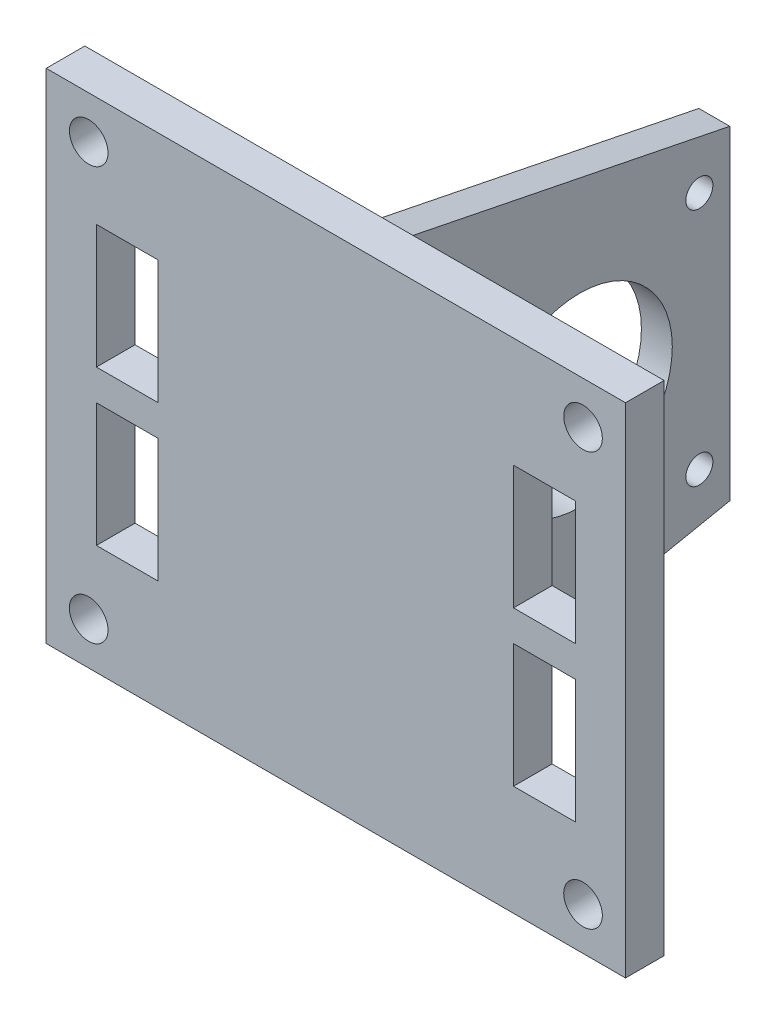
ISO-10303-21;
HEADER;
FILE_DESCRIPTION(('STEP AP214'),'2;1');
FILE_NAME('part.step','',(''),(''),'','','');
FILE_SCHEMA(('AUTOMOTIVE_DESIGN { 1 0 10303 214 1 1 1 1 }'));
ENDSEC;
DATA;
#1=APPLICATION_CONTEXT('core data for automotive mechanical design processes');
#2=APPLICATION_PROTOCOL_DEFINITION('international standard','automotive_design',2000,#1);
#3=PRODUCT_CONTEXT('',#1,'mechanical');
#4=PRODUCT('Part','Part','',(#3));
#5=PRODUCT_RELATED_PRODUCT_CATEGORY('part','',(#4));
#6=PRODUCT_DEFINITION_FORMATION('','',#4);
#7=PRODUCT_DEFINITION_CONTEXT('part definition',#1,'design');
#8=PRODUCT_DEFINITION('design','',#6,#7);
#9=PRODUCT_DEFINITION_SHAPE('','',#8);
#10=(LENGTH_UNIT() NAMED_UNIT(*) SI_UNIT(.MILLI.,.METRE.));
#11=(NAMED_UNIT(*) PLANE_ANGLE_UNIT() SI_UNIT($,.RADIAN.));
#12=(NAMED_UNIT(*) SI_UNIT($,.STERADIAN.) SOLID_ANGLE_UNIT());
#13=UNCERTAINTY_MEASURE_WITH_UNIT(LENGTH_MEASURE(1.E-05),#10,'distance_accuracy_value','');
#14=(GEOMETRIC_REPRESENTATION_CONTEXT(3) GLOBAL_UNCERTAINTY_ASSIGNED_CONTEXT((#13)) GLOBAL_UNIT_ASSIGNED_CONTEXT((#10,
#11,#12)) REPRESENTATION_CONTEXT('',''));
#15=CARTESIAN_POINT('',(0.,0.,0.));
#16=DIRECTION('',(0.,0.,1.));
#17=DIRECTION('',(1.,0.,0.));
#18=AXIS2_PLACEMENT_3D('',#15,#16,#17);
#19=CARTESIAN_POINT('',(0.,0.,0.));
#20=DIRECTION('',(0.,0.,1.));
#21=DIRECTION('',(1.,0.,0.));
#22=AXIS2_PLACEMENT_3D('',#19,#20,#21);
#23=PLANE('',#22);
#24=DIRECTION('',(1.,0.,0.));
#25=VECTOR('',#24,1.);
#26=CARTESIAN_POINT('',(-31.,18.,0.));
#27=LINE('',#26,#25);
#28=CARTESIAN_POINT('',(-31.,18.,0.));
#29=VERTEX_POINT('',#28);
#30=CARTESIAN_POINT('',(-23.,18.,0.));
#31=VERTEX_POINT('',#30);
#32=EDGE_CURVE('E290',#29,#31,#27,.T.);
#33=ORIENTED_EDGE('',*,*,#32,.F.);
#34=DIRECTION('',(0.,1.,0.));
#35=VECTOR('',#34,1.);
#36=CARTESIAN_POINT('',(-31.,2.,0.));
#37=LINE('',#36,#35);
#38=CARTESIAN_POINT('',(-31.,2.,0.));
#39=VERTEX_POINT('',#38);
#40=EDGE_CURVE('E54',#39,#29,#37,.T.);
#41=ORIENTED_EDGE('',*,*,#40,.F.);
#42=DIRECTION('',(-1.,0.,0.));
#43=VECTOR('',#42,1.);
#44=CARTESIAN_POINT('',(-31.,2.,0.));
#45=LINE('',#44,#43);
#46=CARTESIAN_POINT('',(-23.,2.,0.));
#47=VERTEX_POINT('',#46);
#48=EDGE_CURVE('E279',#47,#39,#45,.T.);
#49=ORIENTED_EDGE('',*,*,#48,.F.);
#50=DIRECTION('',(0.,-1.,0.));
#51=VECTOR('',#50,1.);
#52=CARTESIAN_POINT('',(-23.,2.,0.));
#53=LINE('',#52,#51);
#54=EDGE_CURVE('E293',#31,#47,#53,.T.);
#55=ORIENTED_EDGE('',*,*,#54,.F.);
#56=EDGE_LOOP('',(#33,#41,#49,#55));
#57=FACE_BOUND('',#56,.T.);
#58=DIRECTION('',(0.,-1.,0.));
#59=VECTOR('',#58,1.);
#60=CARTESIAN_POINT('',(-23.,-2.,0.));
#61=LINE('',#60,#59);
#62=CARTESIAN_POINT('',(-23.,-2.,0.));
#63=VERTEX_POINT('',#62);
#64=CARTESIAN_POINT('',(-23.,-18.,0.));
#65=VERTEX_POINT('',#64);
#66=EDGE_CURVE('E260',#63,#65,#61,.T.);
#67=ORIENTED_EDGE('',*,*,#66,.F.);
#68=DIRECTION('',(1.,0.,0.));
#69=VECTOR('',#68,1.);
#70=CARTESIAN_POINT('',(-31.,-2.,0.));
#71=LINE('',#70,#69);
#72=CARTESIAN_POINT('',(-31.,-2.,0.));
#73=VERTEX_POINT('',#72);
#74=EDGE_CURVE('E62',#73,#63,#71,.T.);
#75=ORIENTED_EDGE('',*,*,#74,.F.);
#76=DIRECTION('',(0.,1.,0.));
#77=VECTOR('',#76,1.);
#78=CARTESIAN_POINT('',(-31.,-2.,0.));
#79=LINE('',#78,#77);
#80=CARTESIAN_POINT('',(-31.,-18.,0.));
#81=VERTEX_POINT('',#80);
#82=EDGE_CURVE('E249',#81,#73,#79,.T.);
#83=ORIENTED_EDGE('',*,*,#82,.F.);
#84=DIRECTION('',(-1.,0.,0.));
#85=VECTOR('',#84,1.);
#86=CARTESIAN_POINT('',(-31.,-18.,0.));
#87=LINE('',#86,#85);
#88=EDGE_CURVE('E264',#65,#81,#87,.T.);
#89=ORIENTED_EDGE('',*,*,#88,.F.);
#90=EDGE_LOOP('',(#67,#75,#83,#89));
#91=FACE_BOUND('',#90,.T.);
#92=DIRECTION('',(-1.,0.,0.));
#93=VECTOR('',#92,1.);
#94=CARTESIAN_POINT('',(31.,-18.,0.));
#95=LINE('',#94,#93);
#96=CARTESIAN_POINT('',(31.,-18.,0.));
#97=VERTEX_POINT('',#96);
#98=CARTESIAN_POINT('',(23.,-18.,0.));
#99=VERTEX_POINT('',#98);
#100=EDGE_CURVE('E234',#97,#99,#95,.T.);
#101=ORIENTED_EDGE('',*,*,#100,.F.);
#102=DIRECTION('',(0.,-1.,0.));
#103=VECTOR('',#102,1.);
#104=CARTESIAN_POINT('',(31.,-2.,0.));
#105=LINE('',#104,#103);
#106=CARTESIAN_POINT('',(31.,-2.,0.));
#107=VERTEX_POINT('',#106);
#108=EDGE_CURVE('E207',#107,#97,#105,.T.);
#109=ORIENTED_EDGE('',*,*,#108,.F.);
#110=DIRECTION('',(1.,0.,0.));
#111=VECTOR('',#110,1.);
#112=CARTESIAN_POINT('',(31.,-2.,0.));
#113=LINE('',#112,#111);
#114=CARTESIAN_POINT('',(23.,-2.,0.));
#115=VERTEX_POINT('',#114);
#116=EDGE_CURVE('E225',#115,#107,#113,.T.);
#117=ORIENTED_EDGE('',*,*,#116,.F.);
#118=DIRECTION('',(0.,1.,0.));
#119=VECTOR('',#118,1.);
#120=CARTESIAN_POINT('',(23.,-2.,0.));
#121=LINE('',#120,#119);
#122=EDGE_CURVE('E228',#99,#115,#121,.T.);
#123=ORIENTED_EDGE('',*,*,#122,.F.);
#124=EDGE_LOOP('',(#101,#109,#117,#123));
#125=FACE_BOUND('',#124,.T.);
#126=DIRECTION('',(-1.,0.,0.));
#127=VECTOR('',#126,1.);
#128=CARTESIAN_POINT('',(31.,2.,0.));
#129=LINE('',#128,#127);
#130=CARTESIAN_POINT('',(31.,2.,0.));
#131=VERTEX_POINT('',#130);
#132=CARTESIAN_POINT('',(23.,2.,0.));
#133=VERTEX_POINT('',#132);
#134=EDGE_CURVE('E319',#131,#133,#129,.T.);
#135=ORIENTED_EDGE('',*,*,#134,.F.);
#136=DIRECTION('',(0.,-1.,0.));
#137=VECTOR('',#136,1.);
#138=CARTESIAN_POINT('',(31.,2.,0.));
#139=LINE('',#138,#137);
#140=CARTESIAN_POINT('',(31.,18.,0.));
#141=VERTEX_POINT('',#140);
#142=EDGE_CURVE('E241',#141,#131,#139,.T.);
#143=ORIENTED_EDGE('',*,*,#142,.F.);
#144=DIRECTION('',(1.,0.,0.));
#145=VECTOR('',#144,1.);
#146=CARTESIAN_POINT('',(31.,18.,0.));
#147=LINE('',#146,#145);
#148=CARTESIAN_POINT('',(23.,18.,0.));
#149=VERTEX_POINT('',#148);
#150=EDGE_CURVE('E308',#149,#141,#147,.T.);
#151=ORIENTED_EDGE('',*,*,#150,.F.);
#152=DIRECTION('',(0.,1.,0.));
#153=VECTOR('',#152,1.);
#154=CARTESIAN_POINT('',(23.,2.,0.));
#155=LINE('',#154,#153);
#156=EDGE_CURVE('E322',#133,#149,#155,.T.);
#157=ORIENTED_EDGE('',*,*,#156,.F.);
#158=EDGE_LOOP('',(#135,#143,#151,#157));
#159=FACE_BOUND('',#158,.T.);
#160=CARTESIAN_POINT('',(-32.,26.75,0.));
#161=DIRECTION('',(0.,0.,-1.));
#162=DIRECTION('',(-1.,0.,0.));
#163=AXIS2_PLACEMENT_3D('',#160,#161,#162);
#164=CIRCLE('',#163,2.5);
#165=CARTESIAN_POINT('',(-34.5,26.75,0.));
#166=VERTEX_POINT('',#165);
#167=EDGE_CURVE('E336',#166,#166,#164,.T.);
#168=ORIENTED_EDGE('',*,*,#167,.F.);
#169=EDGE_LOOP('',(#168));
#170=FACE_BOUND('',#169,.T.);
#171=CARTESIAN_POINT('',(32.,26.75,0.));
#172=DIRECTION('',(0.,0.,1.));
#173=DIRECTION('',(1.,0.,0.));
#174=AXIS2_PLACEMENT_3D('',#171,#172,#173);
#175=CIRCLE('',#174,2.5);
#176=CARTESIAN_POINT('',(34.5,26.75,0.));
#177=VERTEX_POINT('',#176);
#178=EDGE_CURVE('E339',#177,#177,#175,.T.);
#179=ORIENTED_EDGE('',*,*,#178,.T.);
#180=EDGE_LOOP('',(#179));
#181=FACE_BOUND('',#180,.T.);
#182=DIRECTION('',(0.,-1.,0.));
#183=VECTOR('',#182,1.);
#184=CARTESIAN_POINT('',(-37.5,-32.25,0.));
#185=LINE('',#184,#183);
#186=CARTESIAN_POINT('',(-37.5,32.25,0.));
#187=VERTEX_POINT('',#186);
#188=CARTESIAN_POINT('',(-37.5,-32.25,0.));
#189=VERTEX_POINT('',#188);
#190=EDGE_CURVE('E415',#187,#189,#185,.T.);
#191=ORIENTED_EDGE('',*,*,#190,.F.);
#192=DIRECTION('',(-1.,0.,0.));
#193=VECTOR('',#192,1.);
#194=CARTESIAN_POINT('',(37.5,32.25,0.));
#195=LINE('',#194,#193);
#196=CARTESIAN_POINT('',(37.5,32.25,0.));
#197=VERTEX_POINT('',#196);
#198=EDGE_CURVE('E426',#197,#187,#195,.T.);
#199=ORIENTED_EDGE('',*,*,#198,.F.);
#200=DIRECTION('',(0.,1.,0.));
#201=VECTOR('',#200,1.);
#202=CARTESIAN_POINT('',(37.5,-32.25,0.));
#203=LINE('',#202,#201);
#204=CARTESIAN_POINT('',(37.5,-32.25,0.));
#205=VERTEX_POINT('',#204);
#206=EDGE_CURVE('E437',#205,#197,#203,.T.);
#207=ORIENTED_EDGE('',*,*,#206,.F.);
#208=DIRECTION('',(1.,0.,0.));
#209=VECTOR('',#208,1.);
#210=CARTESIAN_POINT('',(37.5,-32.25,0.));
#211=LINE('',#210,#209);
#212=EDGE_CURVE('E435',#189,#205,#211,.T.);
#213=ORIENTED_EDGE('',*,*,#212,.F.);
#214=EDGE_LOOP('',(#191,#199,#207,#213));
#215=FACE_BOUND('',#214,.T.);
#216=DIRECTION('',(0.,-1.,0.));
#217=VECTOR('',#216,1.);
#218=CARTESIAN_POINT('',(-2.,29.8702225781325,0.));
#219=LINE('',#218,#217);
#220=CARTESIAN_POINT('',(-2.,29.8702225781325,0.));
#221=VERTEX_POINT('',#220);
#222=CARTESIAN_POINT('',(-2.,-29.8702225781326,0.));
#223=VERTEX_POINT('',#222);
#224=EDGE_CURVE('E408',#221,#223,#219,.T.);
#225=ORIENTED_EDGE('',*,*,#224,.T.);
#226=DIRECTION('',(1.,0.,0.));
#227=VECTOR('',#226,1.);
#228=CARTESIAN_POINT('',(-2.,-29.8702225781326,0.));
#229=LINE('',#228,#227);
#230=CARTESIAN_POINT('',(2.,-29.8702225781326,0.));
#231=VERTEX_POINT('',#230);
#232=EDGE_CURVE('E412',#223,#231,#229,.T.);
#233=ORIENTED_EDGE('',*,*,#232,.T.);
#234=DIRECTION('',(0.,-1.,0.));
#235=VECTOR('',#234,1.);
#236=CARTESIAN_POINT('',(2.,29.8702225781325,0.));
#237=LINE('',#236,#235);
#238=CARTESIAN_POINT('',(2.,29.8702225781325,0.));
#239=VERTEX_POINT('',#238);
#240=EDGE_CURVE('E397',#239,#231,#237,.T.);
#241=ORIENTED_EDGE('',*,*,#240,.F.);
#242=DIRECTION('',(1.,0.,0.));
#243=VECTOR('',#242,1.);
#244=CARTESIAN_POINT('',(-2.,29.8702225781325,0.));
#245=LINE('',#244,#243);
#246=EDGE_CURVE('E416',#221,#239,#245,.T.);
#247=ORIENTED_EDGE('',*,*,#246,.F.);
#248=EDGE_LOOP('',(#225,#233,#241,#247));
#249=FACE_BOUND('',#248,.T.);
#250=CARTESIAN_POINT('',(-32.,-26.75,0.));
#251=DIRECTION('',(0.,0.,1.));
#252=DIRECTION('',(1.,0.,0.));
#253=AXIS2_PLACEMENT_3D('',#250,#251,#252);
#254=CIRCLE('',#253,2.5);
#255=CARTESIAN_POINT('',(-29.5,-26.75,0.));
#256=VERTEX_POINT('',#255);
#257=EDGE_CURVE('E343',#256,#256,#254,.T.);
#258=ORIENTED_EDGE('',*,*,#257,.T.);
#259=EDGE_LOOP('',(#258));
#260=FACE_BOUND('',#259,.T.);
#261=CARTESIAN_POINT('',(32.,-26.75,0.));
#262=DIRECTION('',(0.,0.,-1.));
#263=DIRECTION('',(-1.,0.,0.));
#264=AXIS2_PLACEMENT_3D('',#261,#262,#263);
#265=CIRCLE('',#264,2.5);
#266=CARTESIAN_POINT('',(29.5,-26.75,0.));
#267=VERTEX_POINT('',#266);
#268=EDGE_CURVE('E349',#267,#267,#265,.T.);
#269=ORIENTED_EDGE('',*,*,#268,.F.);
#270=EDGE_LOOP('',(#269));
#271=FACE_BOUND('',#270,.T.);
#272=ADVANCED_FACE('F39',(#57,#91,#125,#159,#170,#181,#215,#249,#260,#271),#23,.F.);
#273=CARTESIAN_POINT('',(0.,0.,5.));
#274=DIRECTION('',(0.,0.,1.));
#275=DIRECTION('',(1.,0.,0.));
#276=AXIS2_PLACEMENT_3D('',#273,#274,#275);
#277=PLANE('',#276);
#278=DIRECTION('',(0.,1.,0.));
#279=VECTOR('',#278,1.);
#280=CARTESIAN_POINT('',(-31.,2.,5.));
#281=LINE('',#280,#279);
#282=CARTESIAN_POINT('',(-31.,2.,5.));
#283=VERTEX_POINT('',#282);
#284=CARTESIAN_POINT('',(-31.,18.,5.));
#285=VERTEX_POINT('',#284);
#286=EDGE_CURVE('E275',#283,#285,#281,.T.);
#287=ORIENTED_EDGE('',*,*,#286,.T.);
#288=DIRECTION('',(1.,0.,0.));
#289=VECTOR('',#288,1.);
#290=CARTESIAN_POINT('',(-31.,18.,5.));
#291=LINE('',#290,#289);
#292=CARTESIAN_POINT('',(-23.,18.,5.));
#293=VERTEX_POINT('',#292);
#294=EDGE_CURVE('E278',#285,#293,#291,.T.);
#295=ORIENTED_EDGE('',*,*,#294,.T.);
#296=DIRECTION('',(0.,-1.,0.));
#297=VECTOR('',#296,1.);
#298=CARTESIAN_POINT('',(-23.,2.,5.));
#299=LINE('',#298,#297);
#300=CARTESIAN_POINT('',(-23.,2.,5.));
#301=VERTEX_POINT('',#300);
#302=EDGE_CURVE('E282',#293,#301,#299,.T.);
#303=ORIENTED_EDGE('',*,*,#302,.T.);
#304=DIRECTION('',(-1.,0.,0.));
#305=VECTOR('',#304,1.);
#306=CARTESIAN_POINT('',(-31.,2.,5.));
#307=LINE('',#306,#305);
#308=EDGE_CURVE('E285',#301,#283,#307,.T.);
#309=ORIENTED_EDGE('',*,*,#308,.T.);
#310=EDGE_LOOP('',(#287,#295,#303,#309));
#311=FACE_BOUND('',#310,.T.);
#312=DIRECTION('',(1.,0.,0.));
#313=VECTOR('',#312,1.);
#314=CARTESIAN_POINT('',(-31.,-2.,5.));
#315=LINE('',#314,#313);
#316=CARTESIAN_POINT('',(-31.,-2.,5.));
#317=VERTEX_POINT('',#316);
#318=CARTESIAN_POINT('',(-23.,-2.,5.));
#319=VERTEX_POINT('',#318);
#320=EDGE_CURVE('E245',#317,#319,#315,.T.);
#321=ORIENTED_EDGE('',*,*,#320,.T.);
#322=DIRECTION('',(0.,-1.,0.));
#323=VECTOR('',#322,1.);
#324=CARTESIAN_POINT('',(-23.,-2.,5.));
#325=LINE('',#324,#323);
#326=CARTESIAN_POINT('',(-23.,-18.,5.));
#327=VERTEX_POINT('',#326);
#328=EDGE_CURVE('E248',#319,#327,#325,.T.);
#329=ORIENTED_EDGE('',*,*,#328,.T.);
#330=DIRECTION('',(-1.,0.,0.));
#331=VECTOR('',#330,1.);
#332=CARTESIAN_POINT('',(-31.,-18.,5.));
#333=LINE('',#332,#331);
#334=CARTESIAN_POINT('',(-31.,-18.,5.));
#335=VERTEX_POINT('',#334);
#336=EDGE_CURVE('E252',#327,#335,#333,.T.);
#337=ORIENTED_EDGE('',*,*,#336,.T.);
#338=DIRECTION('',(0.,1.,0.));
#339=VECTOR('',#338,1.);
#340=CARTESIAN_POINT('',(-31.,-2.,5.));
#341=LINE('',#340,#339);
#342=EDGE_CURVE('E255',#335,#317,#341,.T.);
#343=ORIENTED_EDGE('',*,*,#342,.T.);
#344=EDGE_LOOP('',(#321,#329,#337,#343));
#345=FACE_BOUND('',#344,.T.);
#346=DIRECTION('',(0.,-1.,0.));
#347=VECTOR('',#346,1.);
#348=CARTESIAN_POINT('',(31.,-2.,5.));
#349=LINE('',#348,#347);
#350=CARTESIAN_POINT('',(31.,-2.,5.));
#351=VERTEX_POINT('',#350);
#352=CARTESIAN_POINT('',(31.,-18.,5.));
#353=VERTEX_POINT('',#352);
#354=EDGE_CURVE('E204',#351,#353,#349,.T.);
#355=ORIENTED_EDGE('',*,*,#354,.T.);
#356=DIRECTION('',(-1.,0.,0.));
#357=VECTOR('',#356,1.);
#358=CARTESIAN_POINT('',(31.,-18.,5.));
#359=LINE('',#358,#357);
#360=CARTESIAN_POINT('',(23.,-18.,5.));
#361=VERTEX_POINT('',#360);
#362=EDGE_CURVE('E216',#353,#361,#359,.T.);
#363=ORIENTED_EDGE('',*,*,#362,.T.);
#364=DIRECTION('',(0.,1.,0.));
#365=VECTOR('',#364,1.);
#366=CARTESIAN_POINT('',(23.,-2.,5.));
#367=LINE('',#366,#365);
#368=CARTESIAN_POINT('',(23.,-2.,5.));
#369=VERTEX_POINT('',#368);
#370=EDGE_CURVE('E220',#361,#369,#367,.T.);
#371=ORIENTED_EDGE('',*,*,#370,.T.);
#372=DIRECTION('',(1.,0.,0.));
#373=VECTOR('',#372,1.);
#374=CARTESIAN_POINT('',(31.,-2.,5.));
#375=LINE('',#374,#373);
#376=EDGE_CURVE('E212',#369,#351,#375,.T.);
#377=ORIENTED_EDGE('',*,*,#376,.T.);
#378=EDGE_LOOP('',(#355,#363,#371,#377));
#379=FACE_BOUND('',#378,.T.);
#380=DIRECTION('',(0.,-1.,0.));
#381=VECTOR('',#380,1.);
#382=CARTESIAN_POINT('',(31.,2.,5.));
#383=LINE('',#382,#381);
#384=CARTESIAN_POINT('',(31.,18.,5.));
#385=VERTEX_POINT('',#384);
#386=CARTESIAN_POINT('',(31.,2.,5.));
#387=VERTEX_POINT('',#386);
#388=EDGE_CURVE('E304',#385,#387,#383,.T.);
#389=ORIENTED_EDGE('',*,*,#388,.T.);
#390=DIRECTION('',(-1.,0.,0.));
#391=VECTOR('',#390,1.);
#392=CARTESIAN_POINT('',(31.,2.,5.));
#393=LINE('',#392,#391);
#394=CARTESIAN_POINT('',(23.,2.,5.));
#395=VERTEX_POINT('',#394);
#396=EDGE_CURVE('E307',#387,#395,#393,.T.);
#397=ORIENTED_EDGE('',*,*,#396,.T.);
#398=DIRECTION('',(0.,1.,0.));
#399=VECTOR('',#398,1.);
#400=CARTESIAN_POINT('',(23.,2.,5.));
#401=LINE('',#400,#399);
#402=CARTESIAN_POINT('',(23.,18.,5.));
#403=VERTEX_POINT('',#402);
#404=EDGE_CURVE('E311',#395,#403,#401,.T.);
#405=ORIENTED_EDGE('',*,*,#404,.T.);
#406=DIRECTION('',(1.,0.,0.));
#407=VECTOR('',#406,1.);
#408=CARTESIAN_POINT('',(31.,18.,5.));
#409=LINE('',#408,#407);
#410=EDGE_CURVE('E314',#403,#385,#409,.T.);
#411=ORIENTED_EDGE('',*,*,#410,.T.);
#412=EDGE_LOOP('',(#389,#397,#405,#411));
#413=FACE_BOUND('',#412,.T.);
#414=CARTESIAN_POINT('',(-32.,-26.75,5.));
#415=DIRECTION('',(0.,0.,1.));
#416=DIRECTION('',(1.,0.,0.));
#417=AXIS2_PLACEMENT_3D('',#414,#415,#416);
#418=CIRCLE('',#417,2.5);
#419=CARTESIAN_POINT('',(-29.5,-26.75,5.));
#420=VERTEX_POINT('',#419);
#421=EDGE_CURVE('E346',#420,#420,#418,.T.);
#422=ORIENTED_EDGE('',*,*,#421,.F.);
#423=EDGE_LOOP('',(#422));
#424=FACE_BOUND('',#423,.T.);
#425=CARTESIAN_POINT('',(32.,26.75,5.));
#426=DIRECTION('',(0.,0.,1.));
#427=DIRECTION('',(1.,0.,0.));
#428=AXIS2_PLACEMENT_3D('',#425,#426,#427);
#429=CIRCLE('',#428,2.5);
#430=CARTESIAN_POINT('',(34.5,26.75,5.));
#431=VERTEX_POINT('',#430);
#432=EDGE_CURVE('E354',#431,#431,#429,.T.);
#433=ORIENTED_EDGE('',*,*,#432,.F.);
#434=EDGE_LOOP('',(#433));
#435=FACE_BOUND('',#434,.T.);
#436=DIRECTION('',(0.,-1.,0.));
#437=VECTOR('',#436,1.);
#438=CARTESIAN_POINT('',(-37.5,-32.25,5.));
#439=LINE('',#438,#437);
#440=CARTESIAN_POINT('',(-37.5,32.25,5.));
#441=VERTEX_POINT('',#440);
#442=CARTESIAN_POINT('',(-37.5,-32.25,5.));
#443=VERTEX_POINT('',#442);
#444=EDGE_CURVE('E422',#441,#443,#439,.T.);
#445=ORIENTED_EDGE('',*,*,#444,.T.);
#446=DIRECTION('',(1.,0.,0.));
#447=VECTOR('',#446,1.);
#448=CARTESIAN_POINT('',(37.5,-32.25,5.));
#449=LINE('',#448,#447);
#450=CARTESIAN_POINT('',(37.5,-32.25,5.));
#451=VERTEX_POINT('',#450);
#452=EDGE_CURVE('E425',#443,#451,#449,.T.);
#453=ORIENTED_EDGE('',*,*,#452,.T.);
#454=DIRECTION('',(0.,1.,0.));
#455=VECTOR('',#454,1.);
#456=CARTESIAN_POINT('',(37.5,-32.25,5.));
#457=LINE('',#456,#455);
#458=CARTESIAN_POINT('',(37.5,32.25,5.));
#459=VERTEX_POINT('',#458);
#460=EDGE_CURVE('E428',#451,#459,#457,.T.);
#461=ORIENTED_EDGE('',*,*,#460,.T.);
#462=DIRECTION('',(-1.,0.,0.));
#463=VECTOR('',#462,1.);
#464=CARTESIAN_POINT('',(37.5,32.25,5.));
#465=LINE('',#464,#463);
#466=EDGE_CURVE('E430',#459,#441,#465,.T.);
#467=ORIENTED_EDGE('',*,*,#466,.T.);
#468=EDGE_LOOP('',(#445,#453,#461,#467));
#469=FACE_BOUND('',#468,.T.);
#470=CARTESIAN_POINT('',(-32.,26.75,5.));
#471=DIRECTION('',(0.,0.,-1.));
#472=DIRECTION('',(-1.,0.,0.));
#473=AXIS2_PLACEMENT_3D('',#470,#471,#472);
#474=CIRCLE('',#473,2.5);
#475=CARTESIAN_POINT('',(-34.5,26.75,5.));
#476=VERTEX_POINT('',#475);
#477=EDGE_CURVE('E340',#476,#476,#474,.T.);
#478=ORIENTED_EDGE('',*,*,#477,.T.);
#479=EDGE_LOOP('',(#478));
#480=FACE_BOUND('',#479,.T.);
#481=CARTESIAN_POINT('',(32.,-26.75,5.));
#482=DIRECTION('',(0.,0.,-1.));
#483=DIRECTION('',(-1.,0.,0.));
#484=AXIS2_PLACEMENT_3D('',#481,#482,#483);
#485=CIRCLE('',#484,2.5);
#486=CARTESIAN_POINT('',(29.5,-26.75,5.));
#487=VERTEX_POINT('',#486);
#488=EDGE_CURVE('E329',#487,#487,#485,.T.);
#489=ORIENTED_EDGE('',*,*,#488,.T.);
#490=EDGE_LOOP('',(#489));
#491=FACE_BOUND('',#490,.T.);
#492=ADVANCED_FACE('F222',(#311,#345,#379,#413,#424,#435,#469,#480,#491),#277,.T.);
#493=CARTESIAN_POINT('',(-2.,0.,0.));
#494=DIRECTION('',(1.,0.,0.));
#495=DIRECTION('',(0.,0.,-1.));
#496=AXIS2_PLACEMENT_3D('',#493,#494,#495);
#497=PLANE('',#496);
#498=CARTESIAN_POINT('',(-2.,-15.5,-9.05959905154399));
#499=DIRECTION('',(1.,0.,0.));
#500=DIRECTION('',(0.,0.,-1.));
#501=AXIS2_PLACEMENT_3D('',#498,#499,#500);
#502=CIRCLE('',#501,1.75);
#503=CARTESIAN_POINT('',(-2.,-15.5,-10.809599051544));
#504=VERTEX_POINT('',#503);
#505=EDGE_CURVE('E386',#504,#504,#502,.F.);
#506=ORIENTED_EDGE('',*,*,#505,.F.);
#507=EDGE_LOOP('',(#506));
#508=FACE_BOUND('',#507,.T.);
#509=CARTESIAN_POINT('',(-2.,15.5,-9.05959905154399));
#510=DIRECTION('',(1.,0.,0.));
#511=DIRECTION('',(0.,0.,-1.));
#512=AXIS2_PLACEMENT_3D('',#509,#510,#511);
#513=CIRCLE('',#512,1.75);
#514=CARTESIAN_POINT('',(-2.,15.5,-10.809599051544));
#515=VERTEX_POINT('',#514);
#516=EDGE_CURVE('E380',#515,#515,#513,.T.);
#517=ORIENTED_EDGE('',*,*,#516,.T.);
#518=EDGE_LOOP('',(#517));
#519=FACE_BOUND('',#518,.T.);
#520=DIRECTION('',(0.,0.197620224608415,-0.980278657742644));
#521=VECTOR('',#520,1.);
#522=CARTESIAN_POINT('',(-2.,-21.,-44.));
#523=LINE('',#522,#521);
#524=CARTESIAN_POINT('',(-2.,-21.,-44.));
#525=VERTEX_POINT('',#524);
#526=EDGE_CURVE('E399',#223,#525,#523,.T.);
#527=ORIENTED_EDGE('',*,*,#526,.F.);
#528=ORIENTED_EDGE('',*,*,#224,.F.);
#529=DIRECTION('',(0.,0.197620224608415,0.980278657742644));
#530=VECTOR('',#529,1.);
#531=CARTESIAN_POINT('',(-2.,21.,-44.));
#532=LINE('',#531,#530);
#533=CARTESIAN_POINT('',(-2.,21.,-44.));
#534=VERTEX_POINT('',#533);
#535=EDGE_CURVE('E405',#534,#221,#532,.T.);
#536=ORIENTED_EDGE('',*,*,#535,.F.);
#537=DIRECTION('',(0.,1.,0.));
#538=VECTOR('',#537,1.);
#539=CARTESIAN_POINT('',(-2.,21.,-44.));
#540=LINE('',#539,#538);
#541=EDGE_CURVE('E402',#525,#534,#540,.T.);
#542=ORIENTED_EDGE('',*,*,#541,.F.);
#543=EDGE_LOOP('',(#527,#528,#536,#542));
#544=FACE_BOUND('',#543,.T.);
#545=CARTESIAN_POINT('',(-2.,15.5,-40.059599051544));
#546=DIRECTION('',(1.,0.,0.));
#547=DIRECTION('',(0.,0.,-1.));
#548=AXIS2_PLACEMENT_3D('',#545,#546,#547);
#549=CIRCLE('',#548,1.75);
#550=CARTESIAN_POINT('',(-2.,15.5,-41.809599051544));
#551=VERTEX_POINT('',#550);
#552=EDGE_CURVE('E374',#551,#551,#549,.F.);
#553=ORIENTED_EDGE('',*,*,#552,.F.);
#554=EDGE_LOOP('',(#553));
#555=FACE_BOUND('',#554,.T.);
#556=CARTESIAN_POINT('',(-2.,0.,-24.559599051544));
#557=DIRECTION('',(1.,0.,0.));
#558=DIRECTION('',(0.,0.,-1.));
#559=AXIS2_PLACEMENT_3D('',#556,#557,#558);
#560=CIRCLE('',#559,12.);
#561=CARTESIAN_POINT('',(-2.,0.,-36.559599051544));
#562=VERTEX_POINT('',#561);
#563=EDGE_CURVE('E377',#562,#562,#560,.T.);
#564=ORIENTED_EDGE('',*,*,#563,.T.);
#565=EDGE_LOOP('',(#564));
#566=FACE_BOUND('',#565,.T.);
#567=CARTESIAN_POINT('',(-2.,-15.5,-40.059599051544));
#568=DIRECTION('',(1.,0.,0.));
#569=DIRECTION('',(0.,0.,-1.));
#570=AXIS2_PLACEMENT_3D('',#567,#568,#569);
#571=CIRCLE('',#570,1.75);
#572=CARTESIAN_POINT('',(-2.,-15.5,-41.809599051544));
#573=VERTEX_POINT('',#572);
#574=EDGE_CURVE('E383',#573,#573,#571,.T.);
#575=ORIENTED_EDGE('',*,*,#574,.T.);
#576=EDGE_LOOP('',(#575));
#577=FACE_BOUND('',#576,.T.);
#578=ADVANCED_FACE('F479',(#508,#519,#544,#555,#566,#577),#497,.F.);
#579=CARTESIAN_POINT('',(2.,0.,0.));
#580=DIRECTION('',(1.,0.,0.));
#581=DIRECTION('',(0.,0.,-1.));
#582=AXIS2_PLACEMENT_3D('',#579,#580,#581);
#583=PLANE('',#582);
#584=CARTESIAN_POINT('',(2.,-15.5,-9.05959905154399));
#585=DIRECTION('',(-1.,0.,0.));
#586=DIRECTION('',(0.,0.,1.));
#587=AXIS2_PLACEMENT_3D('',#584,#585,#586);
#588=CIRCLE('',#587,1.75);
#589=CARTESIAN_POINT('',(2.,-15.5,-7.30959905154399));
#590=VERTEX_POINT('',#589);
#591=EDGE_CURVE('E357',#590,#590,#588,.T.);
#592=ORIENTED_EDGE('',*,*,#591,.T.);
#593=EDGE_LOOP('',(#592));
#594=FACE_BOUND('',#593,.T.);
#595=CARTESIAN_POINT('',(2.,15.5,-40.059599051544));
#596=DIRECTION('',(1.,0.,0.));
#597=DIRECTION('',(0.,0.,-1.));
#598=AXIS2_PLACEMENT_3D('',#595,#596,#597);
#599=CIRCLE('',#598,1.75);
#600=CARTESIAN_POINT('',(2.,15.5,-41.809599051544));
#601=VERTEX_POINT('',#600);
#602=EDGE_CURVE('E363',#601,#601,#599,.F.);
#603=ORIENTED_EDGE('',*,*,#602,.T.);
#604=EDGE_LOOP('',(#603));
#605=FACE_BOUND('',#604,.T.);
#606=DIRECTION('',(0.,0.197620224608415,-0.980278657742644));
#607=VECTOR('',#606,1.);
#608=CARTESIAN_POINT('',(2.,-21.,-44.));
#609=LINE('',#608,#607);
#610=CARTESIAN_POINT('',(2.,-21.,-44.));
#611=VERTEX_POINT('',#610);
#612=EDGE_CURVE('E389',#231,#611,#609,.T.);
#613=ORIENTED_EDGE('',*,*,#612,.T.);
#614=DIRECTION('',(0.,1.,0.));
#615=VECTOR('',#614,1.);
#616=CARTESIAN_POINT('',(2.,21.,-44.));
#617=LINE('',#616,#615);
#618=CARTESIAN_POINT('',(2.,21.,-44.));
#619=VERTEX_POINT('',#618);
#620=EDGE_CURVE('E392',#611,#619,#617,.T.);
#621=ORIENTED_EDGE('',*,*,#620,.T.);
#622=DIRECTION('',(0.,0.197620224608415,0.980278657742644));
#623=VECTOR('',#622,1.);
#624=CARTESIAN_POINT('',(2.,21.,-44.));
#625=LINE('',#624,#623);
#626=EDGE_CURVE('E395',#619,#239,#625,.T.);
#627=ORIENTED_EDGE('',*,*,#626,.T.);
#628=ORIENTED_EDGE('',*,*,#240,.T.);
#629=EDGE_LOOP('',(#613,#621,#627,#628));
#630=FACE_BOUND('',#629,.T.);
#631=CARTESIAN_POINT('',(2.,0.,-24.559599051544));
#632=DIRECTION('',(1.,0.,0.));
#633=DIRECTION('',(0.,0.,-1.));
#634=AXIS2_PLACEMENT_3D('',#631,#632,#633);
#635=CIRCLE('',#634,12.);
#636=CARTESIAN_POINT('',(2.,0.,-36.559599051544));
#637=VERTEX_POINT('',#636);
#638=EDGE_CURVE('E360',#637,#637,#635,.T.);
#639=ORIENTED_EDGE('',*,*,#638,.F.);
#640=EDGE_LOOP('',(#639));
#641=FACE_BOUND('',#640,.T.);
#642=CARTESIAN_POINT('',(2.,15.5,-9.05959905154399));
#643=DIRECTION('',(1.,0.,0.));
#644=DIRECTION('',(0.,0.,-1.));
#645=AXIS2_PLACEMENT_3D('',#642,#643,#644);
#646=CIRCLE('',#645,1.75);
#647=CARTESIAN_POINT('',(2.,15.5,-10.809599051544));
#648=VERTEX_POINT('',#647);
#649=EDGE_CURVE('E364',#648,#648,#646,.T.);
#650=ORIENTED_EDGE('',*,*,#649,.F.);
#651=EDGE_LOOP('',(#650));
#652=FACE_BOUND('',#651,.T.);
#653=CARTESIAN_POINT('',(2.,-15.5,-40.059599051544));
#654=DIRECTION('',(1.,0.,0.));
#655=DIRECTION('',(0.,0.,-1.));
#656=AXIS2_PLACEMENT_3D('',#653,#654,#655);
#657=CIRCLE('',#656,1.75);
#658=CARTESIAN_POINT('',(2.,-15.5,-41.809599051544));
#659=VERTEX_POINT('',#658);
#660=EDGE_CURVE('E367',#659,#659,#657,.T.);
#661=ORIENTED_EDGE('',*,*,#660,.F.);
#662=EDGE_LOOP('',(#661));
#663=FACE_BOUND('',#662,.T.);
#664=ADVANCED_FACE('F472',(#594,#605,#630,#641,#652,#663),#583,.T.);
#665=CARTESIAN_POINT('',(-37.5,-32.25,5.));
#666=DIRECTION('',(1.,0.,0.));
#667=DIRECTION('',(0.,0.,-1.));
#668=AXIS2_PLACEMENT_3D('',#665,#666,#667);
#669=PLANE('',#668);
#670=ORIENTED_EDGE('',*,*,#190,.T.);
#671=DIRECTION('',(0.,0.,-1.));
#672=VECTOR('',#671,1.);
#673=CARTESIAN_POINT('',(-37.5,-32.25,5.));
#674=LINE('',#673,#672);
#675=EDGE_CURVE('E12',#443,#189,#674,.T.);
#676=ORIENTED_EDGE('',*,*,#675,.F.);
#677=ORIENTED_EDGE('',*,*,#444,.F.);
#678=DIRECTION('',(0.,0.,-1.));
#679=VECTOR('',#678,1.);
#680=CARTESIAN_POINT('',(-37.5,32.25,5.));
#681=LINE('',#680,#679);
#682=EDGE_CURVE('E432',#441,#187,#681,.T.);
#683=ORIENTED_EDGE('',*,*,#682,.T.);
#684=EDGE_LOOP('',(#670,#676,#677,#683));
#685=FACE_BOUND('',#684,.T.);
#686=ADVANCED_FACE('F41',(#685),#669,.F.);
#687=CARTESIAN_POINT('',(37.5,-32.25,5.));
#688=DIRECTION('',(0.,1.,0.));
#689=DIRECTION('',(0.,0.,1.));
#690=AXIS2_PLACEMENT_3D('',#687,#688,#689);
#691=PLANE('',#690);
#692=ORIENTED_EDGE('',*,*,#212,.T.);
#693=DIRECTION('',(0.,0.,-1.));
#694=VECTOR('',#693,1.);
#695=CARTESIAN_POINT('',(37.5,-32.25,5.));
#696=LINE('',#695,#694);
#697=EDGE_CURVE('E47',#451,#205,#696,.T.);
#698=ORIENTED_EDGE('',*,*,#697,.F.);
#699=ORIENTED_EDGE('',*,*,#452,.F.);
#700=ORIENTED_EDGE('',*,*,#675,.T.);
#701=EDGE_LOOP('',(#692,#698,#699,#700));
#702=FACE_BOUND('',#701,.T.);
#703=ADVANCED_FACE('F465',(#702),#691,.F.);
#704=CARTESIAN_POINT('',(37.5,-32.25,5.));
#705=DIRECTION('',(-1.,0.,0.));
#706=DIRECTION('',(0.,0.,1.));
#707=AXIS2_PLACEMENT_3D('',#704,#705,#706);
#708=PLANE('',#707);
#709=ORIENTED_EDGE('',*,*,#206,.T.);
#710=DIRECTION('',(0.,0.,-1.));
#711=VECTOR('',#710,1.);
#712=CARTESIAN_POINT('',(37.5,32.25,5.));
#713=LINE('',#712,#711);
#714=EDGE_CURVE('E442',#459,#197,#713,.T.);
#715=ORIENTED_EDGE('',*,*,#714,.F.);
#716=ORIENTED_EDGE('',*,*,#460,.F.);
#717=ORIENTED_EDGE('',*,*,#697,.T.);
#718=EDGE_LOOP('',(#709,#715,#716,#717));
#719=FACE_BOUND('',#718,.T.);
#720=ADVANCED_FACE('F449',(#719),#708,.F.);
#721=CARTESIAN_POINT('',(37.5,32.25,5.));
#722=DIRECTION('',(0.,-1.,0.));
#723=DIRECTION('',(0.,0.,-1.));
#724=AXIS2_PLACEMENT_3D('',#721,#722,#723);
#725=PLANE('',#724);
#726=ORIENTED_EDGE('',*,*,#198,.T.);
#727=ORIENTED_EDGE('',*,*,#682,.F.);
#728=ORIENTED_EDGE('',*,*,#466,.F.);
#729=ORIENTED_EDGE('',*,*,#714,.T.);
#730=EDGE_LOOP('',(#726,#727,#728,#729));
#731=FACE_BOUND('',#730,.T.);
#732=ADVANCED_FACE('F458',(#731),#725,.F.);
#733=CARTESIAN_POINT('',(-2.,-21.,-44.));
#734=DIRECTION('',(0.,-0.980278657742644,-0.197620224608415));
#735=DIRECTION('',(0.,0.197620224608415,-0.980278657742644));
#736=AXIS2_PLACEMENT_3D('',#733,#734,#735);
#737=PLANE('',#736);
#738=DIRECTION('',(1.,0.,0.));
#739=VECTOR('',#738,1.);
#740=CARTESIAN_POINT('',(-2.,-21.,-44.));
#741=LINE('',#740,#739);
#742=EDGE_CURVE('E411',#525,#611,#741,.T.);
#743=ORIENTED_EDGE('',*,*,#742,.T.);
#744=ORIENTED_EDGE('',*,*,#612,.F.);
#745=ORIENTED_EDGE('',*,*,#232,.F.);
#746=ORIENTED_EDGE('',*,*,#526,.T.);
#747=EDGE_LOOP('',(#743,#744,#745,#746));
#748=FACE_BOUND('',#747,.T.);
#749=ADVANCED_FACE('F487',(#748),#737,.T.);
#750=CARTESIAN_POINT('',(-2.,21.,-44.));
#751=DIRECTION('',(0.,0.980278657742644,-0.197620224608415));
#752=DIRECTION('',(0.,0.197620224608415,0.980278657742644));
#753=AXIS2_PLACEMENT_3D('',#750,#751,#752);
#754=PLANE('',#753);
#755=ORIENTED_EDGE('',*,*,#246,.T.);
#756=ORIENTED_EDGE('',*,*,#626,.F.);
#757=DIRECTION('',(1.,0.,0.));
#758=VECTOR('',#757,1.);
#759=CARTESIAN_POINT('',(-2.,21.,-44.));
#760=LINE('',#759,#758);
#761=EDGE_CURVE('E419',#534,#619,#760,.T.);
#762=ORIENTED_EDGE('',*,*,#761,.F.);
#763=ORIENTED_EDGE('',*,*,#535,.T.);
#764=EDGE_LOOP('',(#755,#756,#762,#763));
#765=FACE_BOUND('',#764,.T.);
#766=ADVANCED_FACE('F491',(#765),#754,.T.);
#767=CARTESIAN_POINT('',(-2.,21.,-44.));
#768=DIRECTION('',(0.,0.,-1.));
#769=DIRECTION('',(0.,1.,0.));
#770=AXIS2_PLACEMENT_3D('',#767,#768,#769);
#771=PLANE('',#770);
#772=ORIENTED_EDGE('',*,*,#761,.T.);
#773=ORIENTED_EDGE('',*,*,#620,.F.);
#774=ORIENTED_EDGE('',*,*,#742,.F.);
#775=ORIENTED_EDGE('',*,*,#541,.T.);
#776=EDGE_LOOP('',(#772,#773,#774,#775));
#777=FACE_BOUND('',#776,.T.);
#778=ADVANCED_FACE('F496',(#777),#771,.T.);
#779=CARTESIAN_POINT('',(-37.5,15.5,-40.059599051544));
#780=DIRECTION('',(1.,0.,0.));
#781=DIRECTION('',(0.,0.,-1.));
#782=AXIS2_PLACEMENT_3D('',#779,#780,#781);
#783=CYLINDRICAL_SURFACE('',#782,1.75);
#784=ORIENTED_EDGE('',*,*,#602,.F.);
#785=EDGE_LOOP('',(#784));
#786=FACE_BOUND('',#785,.T.);
#787=ORIENTED_EDGE('',*,*,#552,.T.);
#788=EDGE_LOOP('',(#787));
#789=FACE_BOUND('',#788,.T.);
#790=ADVANCED_FACE('F501',(#786,#789),#783,.F.);
#791=CARTESIAN_POINT('',(-37.5,0.,-24.559599051544));
#792=DIRECTION('',(1.,0.,0.));
#793=DIRECTION('',(0.,0.,-1.));
#794=AXIS2_PLACEMENT_3D('',#791,#792,#793);
#795=CYLINDRICAL_SURFACE('',#794,12.);
#796=ORIENTED_EDGE('',*,*,#638,.T.);
#797=EDGE_LOOP('',(#796));
#798=FACE_BOUND('',#797,.T.);
#799=ORIENTED_EDGE('',*,*,#563,.F.);
#800=EDGE_LOOP('',(#799));
#801=FACE_BOUND('',#800,.T.);
#802=ADVANCED_FACE('F512',(#798,#801),#795,.F.);
#803=CARTESIAN_POINT('',(-37.5,15.5,-9.05959905154399));
#804=DIRECTION('',(1.,0.,0.));
#805=DIRECTION('',(0.,0.,-1.));
#806=AXIS2_PLACEMENT_3D('',#803,#804,#805);
#807=CYLINDRICAL_SURFACE('',#806,1.75);
#808=ORIENTED_EDGE('',*,*,#649,.T.);
#809=EDGE_LOOP('',(#808));
#810=FACE_BOUND('',#809,.T.);
#811=ORIENTED_EDGE('',*,*,#516,.F.);
#812=EDGE_LOOP('',(#811));
#813=FACE_BOUND('',#812,.T.);
#814=ADVANCED_FACE('F522',(#810,#813),#807,.F.);
#815=CARTESIAN_POINT('',(-37.5,-15.5,-40.059599051544));
#816=DIRECTION('',(1.,0.,0.));
#817=DIRECTION('',(0.,0.,-1.));
#818=AXIS2_PLACEMENT_3D('',#815,#816,#817);
#819=CYLINDRICAL_SURFACE('',#818,1.75);
#820=ORIENTED_EDGE('',*,*,#660,.T.);
#821=EDGE_LOOP('',(#820));
#822=FACE_BOUND('',#821,.T.);
#823=ORIENTED_EDGE('',*,*,#574,.F.);
#824=EDGE_LOOP('',(#823));
#825=FACE_BOUND('',#824,.T.);
#826=ADVANCED_FACE('F518',(#822,#825),#819,.F.);
#827=CARTESIAN_POINT('',(-37.5,-15.5,-9.05959905154399));
#828=DIRECTION('',(1.,0.,0.));
#829=DIRECTION('',(0.,0.,-1.));
#830=AXIS2_PLACEMENT_3D('',#827,#828,#829);
#831=CYLINDRICAL_SURFACE('',#830,1.75);
#832=ORIENTED_EDGE('',*,*,#591,.F.);
#833=EDGE_LOOP('',(#832));
#834=FACE_BOUND('',#833,.T.);
#835=ORIENTED_EDGE('',*,*,#505,.T.);
#836=EDGE_LOOP('',(#835));
#837=FACE_BOUND('',#836,.T.);
#838=ADVANCED_FACE('F514',(#834,#837),#831,.F.);
#839=CARTESIAN_POINT('',(32.,26.75,5.));
#840=DIRECTION('',(0.,0.,-1.));
#841=DIRECTION('',(-1.,0.,0.));
#842=AXIS2_PLACEMENT_3D('',#839,#840,#841);
#843=CYLINDRICAL_SURFACE('',#842,2.5);
#844=ORIENTED_EDGE('',*,*,#432,.T.);
#845=EDGE_LOOP('',(#844));
#846=FACE_BOUND('',#845,.T.);
#847=ORIENTED_EDGE('',*,*,#178,.F.);
#848=EDGE_LOOP('',(#847));
#849=FACE_BOUND('',#848,.T.);
#850=ADVANCED_FACE('F517',(#846,#849),#843,.F.);
#851=CARTESIAN_POINT('',(-32.,26.75,5.));
#852=DIRECTION('',(0.,0.,-1.));
#853=DIRECTION('',(-1.,0.,0.));
#854=AXIS2_PLACEMENT_3D('',#851,#852,#853);
#855=CYLINDRICAL_SURFACE('',#854,2.5);
#856=ORIENTED_EDGE('',*,*,#477,.F.);
#857=EDGE_LOOP('',(#856));
#858=FACE_BOUND('',#857,.T.);
#859=ORIENTED_EDGE('',*,*,#167,.T.);
#860=EDGE_LOOP('',(#859));
#861=FACE_BOUND('',#860,.T.);
#862=ADVANCED_FACE('F532',(#858,#861),#855,.F.);
#863=CARTESIAN_POINT('',(-32.,-26.75,5.));
#864=DIRECTION('',(0.,0.,-1.));
#865=DIRECTION('',(-1.,0.,0.));
#866=AXIS2_PLACEMENT_3D('',#863,#864,#865);
#867=CYLINDRICAL_SURFACE('',#866,2.5);
#868=ORIENTED_EDGE('',*,*,#421,.T.);
#869=EDGE_LOOP('',(#868));
#870=FACE_BOUND('',#869,.T.);
#871=ORIENTED_EDGE('',*,*,#257,.F.);
#872=EDGE_LOOP('',(#871));
#873=FACE_BOUND('',#872,.T.);
#874=ADVANCED_FACE('F538',(#870,#873),#867,.F.);
#875=CARTESIAN_POINT('',(32.,-26.75,5.));
#876=DIRECTION('',(0.,0.,-1.));
#877=DIRECTION('',(-1.,0.,0.));
#878=AXIS2_PLACEMENT_3D('',#875,#876,#877);
#879=CYLINDRICAL_SURFACE('',#878,2.5);
#880=ORIENTED_EDGE('',*,*,#488,.F.);
#881=EDGE_LOOP('',(#880));
#882=FACE_BOUND('',#881,.T.);
#883=ORIENTED_EDGE('',*,*,#268,.T.);
#884=EDGE_LOOP('',(#883));
#885=FACE_BOUND('',#884,.T.);
#886=ADVANCED_FACE('F534',(#882,#885),#879,.F.);
#887=CARTESIAN_POINT('',(31.,2.,5.));
#888=DIRECTION('',(1.,0.,0.));
#889=DIRECTION('',(0.,1.,0.));
#890=AXIS2_PLACEMENT_3D('',#887,#888,#889);
#891=PLANE('',#890);
#892=ORIENTED_EDGE('',*,*,#142,.T.);
#893=DIRECTION('',(0.,0.,-1.));
#894=VECTOR('',#893,1.);
#895=CARTESIAN_POINT('',(31.,2.,5.));
#896=LINE('',#895,#894);
#897=EDGE_CURVE('E317',#387,#131,#896,.T.);
#898=ORIENTED_EDGE('',*,*,#897,.F.);
#899=ORIENTED_EDGE('',*,*,#388,.F.);
#900=DIRECTION('',(0.,0.,-1.));
#901=VECTOR('',#900,1.);
#902=CARTESIAN_POINT('',(31.,18.,5.));
#903=LINE('',#902,#901);
#904=EDGE_CURVE('E327',#385,#141,#903,.T.);
#905=ORIENTED_EDGE('',*,*,#904,.T.);
#906=EDGE_LOOP('',(#892,#898,#899,#905));
#907=FACE_BOUND('',#906,.T.);
#908=ADVANCED_FACE('F537',(#907),#891,.F.);
#909=CARTESIAN_POINT('',(31.,18.,5.));
#910=DIRECTION('',(0.,1.,0.));
#911=DIRECTION('',(0.,0.,1.));
#912=AXIS2_PLACEMENT_3D('',#909,#910,#911);
#913=PLANE('',#912);
#914=ORIENTED_EDGE('',*,*,#150,.T.);
#915=ORIENTED_EDGE('',*,*,#904,.F.);
#916=ORIENTED_EDGE('',*,*,#410,.F.);
#917=DIRECTION('',(0.,0.,-1.));
#918=VECTOR('',#917,1.);
#919=CARTESIAN_POINT('',(23.,18.,5.));
#920=LINE('',#919,#918);
#921=EDGE_CURVE('E330',#403,#149,#920,.T.);
#922=ORIENTED_EDGE('',*,*,#921,.T.);
#923=EDGE_LOOP('',(#914,#915,#916,#922));
#924=FACE_BOUND('',#923,.T.);
#925=ADVANCED_FACE('F548',(#924),#913,.F.);
#926=CARTESIAN_POINT('',(23.,2.,5.));
#927=DIRECTION('',(-1.,0.,0.));
#928=DIRECTION('',(0.,-1.,0.));
#929=AXIS2_PLACEMENT_3D('',#926,#927,#928);
#930=PLANE('',#929);
#931=ORIENTED_EDGE('',*,*,#156,.T.);
#932=ORIENTED_EDGE('',*,*,#921,.F.);
#933=ORIENTED_EDGE('',*,*,#404,.F.);
#934=DIRECTION('',(0.,0.,-1.));
#935=VECTOR('',#934,1.);
#936=CARTESIAN_POINT('',(23.,2.,5.));
#937=LINE('',#936,#935);
#938=EDGE_CURVE('E332',#395,#133,#937,.T.);
#939=ORIENTED_EDGE('',*,*,#938,.T.);
#940=EDGE_LOOP('',(#931,#932,#933,#939));
#941=FACE_BOUND('',#940,.T.);
#942=ADVANCED_FACE('F553',(#941),#930,.F.);
#943=CARTESIAN_POINT('',(31.,2.,5.));
#944=DIRECTION('',(0.,-1.,0.));
#945=DIRECTION('',(1.,0.,0.));
#946=AXIS2_PLACEMENT_3D('',#943,#944,#945);
#947=PLANE('',#946);
#948=ORIENTED_EDGE('',*,*,#134,.T.);
#949=ORIENTED_EDGE('',*,*,#938,.F.);
#950=ORIENTED_EDGE('',*,*,#396,.F.);
#951=ORIENTED_EDGE('',*,*,#897,.T.);
#952=EDGE_LOOP('',(#948,#949,#950,#951));
#953=FACE_BOUND('',#952,.T.);
#954=ADVANCED_FACE('F550',(#953),#947,.F.);
#955=CARTESIAN_POINT('',(31.,-2.,5.));
#956=DIRECTION('',(1.,0.,0.));
#957=DIRECTION('',(0.,1.,0.));
#958=AXIS2_PLACEMENT_3D('',#955,#956,#957);
#959=PLANE('',#958);
#960=ORIENTED_EDGE('',*,*,#108,.T.);
#961=DIRECTION('',(0.,0.,-1.));
#962=VECTOR('',#961,1.);
#963=CARTESIAN_POINT('',(31.,-18.,5.));
#964=LINE('',#963,#962);
#965=EDGE_CURVE('E200',#353,#97,#964,.T.);
#966=ORIENTED_EDGE('',*,*,#965,.F.);
#967=ORIENTED_EDGE('',*,*,#354,.F.);
#968=DIRECTION('',(0.,0.,-1.));
#969=VECTOR('',#968,1.);
#970=CARTESIAN_POINT('',(31.,-2.,5.));
#971=LINE('',#970,#969);
#972=EDGE_CURVE('E239',#351,#107,#971,.T.);
#973=ORIENTED_EDGE('',*,*,#972,.T.);
#974=EDGE_LOOP('',(#960,#966,#967,#973));
#975=FACE_BOUND('',#974,.T.);
#976=ADVANCED_FACE('F202',(#975),#959,.F.);
#977=CARTESIAN_POINT('',(31.,-2.,5.));
#978=DIRECTION('',(0.,1.,0.));
#979=DIRECTION('',(-1.,0.,0.));
#980=AXIS2_PLACEMENT_3D('',#977,#978,#979);
#981=PLANE('',#980);
#982=ORIENTED_EDGE('',*,*,#116,.T.);
#983=ORIENTED_EDGE('',*,*,#972,.F.);
#984=ORIENTED_EDGE('',*,*,#376,.F.);
#985=DIRECTION('',(0.,0.,-1.));
#986=VECTOR('',#985,1.);
#987=CARTESIAN_POINT('',(23.,-2.,5.));
#988=LINE('',#987,#986);
#989=EDGE_CURVE('E242',#369,#115,#988,.T.);
#990=ORIENTED_EDGE('',*,*,#989,.T.);
#991=EDGE_LOOP('',(#982,#983,#984,#990));
#992=FACE_BOUND('',#991,.T.);
#993=ADVANCED_FACE('F593',(#992),#981,.F.);
#994=CARTESIAN_POINT('',(23.,-2.,5.));
#995=DIRECTION('',(-1.,0.,0.));
#996=DIRECTION('',(0.,-1.,0.));
#997=AXIS2_PLACEMENT_3D('',#994,#995,#996);
#998=PLANE('',#997);
#999=ORIENTED_EDGE('',*,*,#122,.T.);
#1000=ORIENTED_EDGE('',*,*,#989,.F.);
#1001=ORIENTED_EDGE('',*,*,#370,.F.);
#1002=DIRECTION('',(0.,0.,-1.));
#1003=VECTOR('',#1002,1.);
#1004=CARTESIAN_POINT('',(23.,-18.,5.));
#1005=LINE('',#1004,#1003);
#1006=EDGE_CURVE('E211',#361,#99,#1005,.T.);
#1007=ORIENTED_EDGE('',*,*,#1006,.T.);
#1008=EDGE_LOOP('',(#999,#1000,#1001,#1007));
#1009=FACE_BOUND('',#1008,.T.);
#1010=ADVANCED_FACE('F596',(#1009),#998,.F.);
#1011=CARTESIAN_POINT('',(31.,-18.,5.));
#1012=DIRECTION('',(0.,-1.,0.));
#1013=DIRECTION('',(0.,0.,-1.));
#1014=AXIS2_PLACEMENT_3D('',#1011,#1012,#1013);
#1015=PLANE('',#1014);
#1016=ORIENTED_EDGE('',*,*,#100,.T.);
#1017=ORIENTED_EDGE('',*,*,#1006,.F.);
#1018=ORIENTED_EDGE('',*,*,#362,.F.);
#1019=ORIENTED_EDGE('',*,*,#965,.T.);
#1020=EDGE_LOOP('',(#1016,#1017,#1018,#1019));
#1021=FACE_BOUND('',#1020,.T.);
#1022=ADVANCED_FACE('F217',(#1021),#1015,.F.);
#1023=CARTESIAN_POINT('',(-31.,-2.,5.));
#1024=DIRECTION('',(0.,1.,0.));
#1025=DIRECTION('',(-1.,0.,0.));
#1026=AXIS2_PLACEMENT_3D('',#1023,#1024,#1025);
#1027=PLANE('',#1026);
#1028=ORIENTED_EDGE('',*,*,#74,.T.);
#1029=DIRECTION('',(0.,0.,-1.));
#1030=VECTOR('',#1029,1.);
#1031=CARTESIAN_POINT('',(-23.,-2.,5.));
#1032=LINE('',#1031,#1030);
#1033=EDGE_CURVE('E258',#319,#63,#1032,.T.);
#1034=ORIENTED_EDGE('',*,*,#1033,.F.);
#1035=ORIENTED_EDGE('',*,*,#320,.F.);
#1036=DIRECTION('',(0.,0.,-1.));
#1037=VECTOR('',#1036,1.);
#1038=CARTESIAN_POINT('',(-31.,-2.,5.));
#1039=LINE('',#1038,#1037);
#1040=EDGE_CURVE('E235',#317,#73,#1039,.T.);
#1041=ORIENTED_EDGE('',*,*,#1040,.T.);
#1042=EDGE_LOOP('',(#1028,#1034,#1035,#1041));
#1043=FACE_BOUND('',#1042,.T.);
#1044=ADVANCED_FACE('F577',(#1043),#1027,.F.);
#1045=CARTESIAN_POINT('',(-31.,-2.,5.));
#1046=DIRECTION('',(-1.,0.,0.));
#1047=DIRECTION('',(0.,-1.,0.));
#1048=AXIS2_PLACEMENT_3D('',#1045,#1046,#1047);
#1049=PLANE('',#1048);
#1050=ORIENTED_EDGE('',*,*,#82,.T.);
#1051=ORIENTED_EDGE('',*,*,#1040,.F.);
#1052=ORIENTED_EDGE('',*,*,#342,.F.);
#1053=DIRECTION('',(0.,0.,-1.));
#1054=VECTOR('',#1053,1.);
#1055=CARTESIAN_POINT('',(-31.,-18.,5.));
#1056=LINE('',#1055,#1054);
#1057=EDGE_CURVE('E270',#335,#81,#1056,.T.);
#1058=ORIENTED_EDGE('',*,*,#1057,.T.);
#1059=EDGE_LOOP('',(#1050,#1051,#1052,#1058));
#1060=FACE_BOUND('',#1059,.T.);
#1061=ADVANCED_FACE('F580',(#1060),#1049,.F.);
#1062=CARTESIAN_POINT('',(-31.,-18.,5.));
#1063=DIRECTION('',(0.,-1.,0.));
#1064=DIRECTION('',(0.,0.,-1.));
#1065=AXIS2_PLACEMENT_3D('',#1062,#1063,#1064);
#1066=PLANE('',#1065);
#1067=ORIENTED_EDGE('',*,*,#88,.T.);
#1068=ORIENTED_EDGE('',*,*,#1057,.F.);
#1069=ORIENTED_EDGE('',*,*,#336,.F.);
#1070=DIRECTION('',(0.,0.,-1.));
#1071=VECTOR('',#1070,1.);
#1072=CARTESIAN_POINT('',(-23.,-18.,5.));
#1073=LINE('',#1072,#1071);
#1074=EDGE_CURVE('E272',#327,#65,#1073,.T.);
#1075=ORIENTED_EDGE('',*,*,#1074,.T.);
#1076=EDGE_LOOP('',(#1067,#1068,#1069,#1075));
#1077=FACE_BOUND('',#1076,.T.);
#1078=ADVANCED_FACE('F583',(#1077),#1066,.F.);
#1079=CARTESIAN_POINT('',(-23.,-2.,5.));
#1080=DIRECTION('',(1.,0.,0.));
#1081=DIRECTION('',(0.,1.,0.));
#1082=AXIS2_PLACEMENT_3D('',#1079,#1080,#1081);
#1083=PLANE('',#1082);
#1084=ORIENTED_EDGE('',*,*,#66,.T.);
#1085=ORIENTED_EDGE('',*,*,#1074,.F.);
#1086=ORIENTED_EDGE('',*,*,#328,.F.);
#1087=ORIENTED_EDGE('',*,*,#1033,.T.);
#1088=EDGE_LOOP('',(#1084,#1085,#1086,#1087));
#1089=FACE_BOUND('',#1088,.T.);
#1090=ADVANCED_FACE('F565',(#1089),#1083,.F.);
#1091=CARTESIAN_POINT('',(-31.,2.,5.));
#1092=DIRECTION('',(-1.,0.,0.));
#1093=DIRECTION('',(0.,-1.,0.));
#1094=AXIS2_PLACEMENT_3D('',#1091,#1092,#1093);
#1095=PLANE('',#1094);
#1096=ORIENTED_EDGE('',*,*,#40,.T.);
#1097=DIRECTION('',(0.,0.,-1.));
#1098=VECTOR('',#1097,1.);
#1099=CARTESIAN_POINT('',(-31.,18.,5.));
#1100=LINE('',#1099,#1098);
#1101=EDGE_CURVE('E288',#285,#29,#1100,.T.);
#1102=ORIENTED_EDGE('',*,*,#1101,.F.);
#1103=ORIENTED_EDGE('',*,*,#286,.F.);
#1104=DIRECTION('',(0.,0.,-1.));
#1105=VECTOR('',#1104,1.);
#1106=CARTESIAN_POINT('',(-31.,2.,5.));
#1107=LINE('',#1106,#1105);
#1108=EDGE_CURVE('E261',#283,#39,#1107,.T.);
#1109=ORIENTED_EDGE('',*,*,#1108,.T.);
#1110=EDGE_LOOP('',(#1096,#1102,#1103,#1109));
#1111=FACE_BOUND('',#1110,.T.);
#1112=ADVANCED_FACE('F561',(#1111),#1095,.F.);
#1113=CARTESIAN_POINT('',(-31.,2.,5.));
#1114=DIRECTION('',(0.,-1.,0.));
#1115=DIRECTION('',(1.,0.,0.));
#1116=AXIS2_PLACEMENT_3D('',#1113,#1114,#1115);
#1117=PLANE('',#1116);
#1118=ORIENTED_EDGE('',*,*,#48,.T.);
#1119=ORIENTED_EDGE('',*,*,#1108,.F.);
#1120=ORIENTED_EDGE('',*,*,#308,.F.);
#1121=DIRECTION('',(0.,0.,-1.));
#1122=VECTOR('',#1121,1.);
#1123=CARTESIAN_POINT('',(-23.,2.,5.));
#1124=LINE('',#1123,#1122);
#1125=EDGE_CURVE('E299',#301,#47,#1124,.T.);
#1126=ORIENTED_EDGE('',*,*,#1125,.T.);
#1127=EDGE_LOOP('',(#1118,#1119,#1120,#1126));
#1128=FACE_BOUND('',#1127,.T.);
#1129=ADVANCED_FACE('F564',(#1128),#1117,.F.);
#1130=CARTESIAN_POINT('',(-23.,2.,5.));
#1131=DIRECTION('',(1.,0.,0.));
#1132=DIRECTION('',(0.,1.,0.));
#1133=AXIS2_PLACEMENT_3D('',#1130,#1131,#1132);
#1134=PLANE('',#1133);
#1135=ORIENTED_EDGE('',*,*,#54,.T.);
#1136=ORIENTED_EDGE('',*,*,#1125,.F.);
#1137=ORIENTED_EDGE('',*,*,#302,.F.);
#1138=DIRECTION('',(0.,0.,-1.));
#1139=VECTOR('',#1138,1.);
#1140=CARTESIAN_POINT('',(-23.,18.,5.));
#1141=LINE('',#1140,#1139);
#1142=EDGE_CURVE('E301',#293,#31,#1141,.T.);
#1143=ORIENTED_EDGE('',*,*,#1142,.T.);
#1144=EDGE_LOOP('',(#1135,#1136,#1137,#1143));
#1145=FACE_BOUND('',#1144,.T.);
#1146=ADVANCED_FACE('F569',(#1145),#1134,.F.);
#1147=CARTESIAN_POINT('',(-31.,18.,5.));
#1148=DIRECTION('',(0.,1.,0.));
#1149=DIRECTION('',(0.,0.,1.));
#1150=AXIS2_PLACEMENT_3D('',#1147,#1148,#1149);
#1151=PLANE('',#1150);
#1152=ORIENTED_EDGE('',*,*,#32,.T.);
#1153=ORIENTED_EDGE('',*,*,#1142,.F.);
#1154=ORIENTED_EDGE('',*,*,#294,.F.);
#1155=ORIENTED_EDGE('',*,*,#1101,.T.);
#1156=EDGE_LOOP('',(#1152,#1153,#1154,#1155));
#1157=FACE_BOUND('',#1156,.T.);
#1158=ADVANCED_FACE('F566',(#1157),#1151,.F.);
#1159=CLOSED_SHELL('',(#272,#492,#578,#664,#686,#703,#720,#732,#749,#766,#778,#790,#802,#814,
#826,#838,#850,#862,#874,#886,#908,#925,#942,#954,#976,#993,#1010,#1022,#1044,#1061,#1078,#1090,
#1112,#1129,#1146,#1158));
#1160=MANIFOLD_SOLID_BREP('B2',#1159);
#1161=ADVANCED_BREP_SHAPE_REPRESENTATION('',(#18,#1160),#14);
#1162=SHAPE_DEFINITION_REPRESENTATION(#9,#1161);
ENDSEC;
END-ISO-10303-21;
